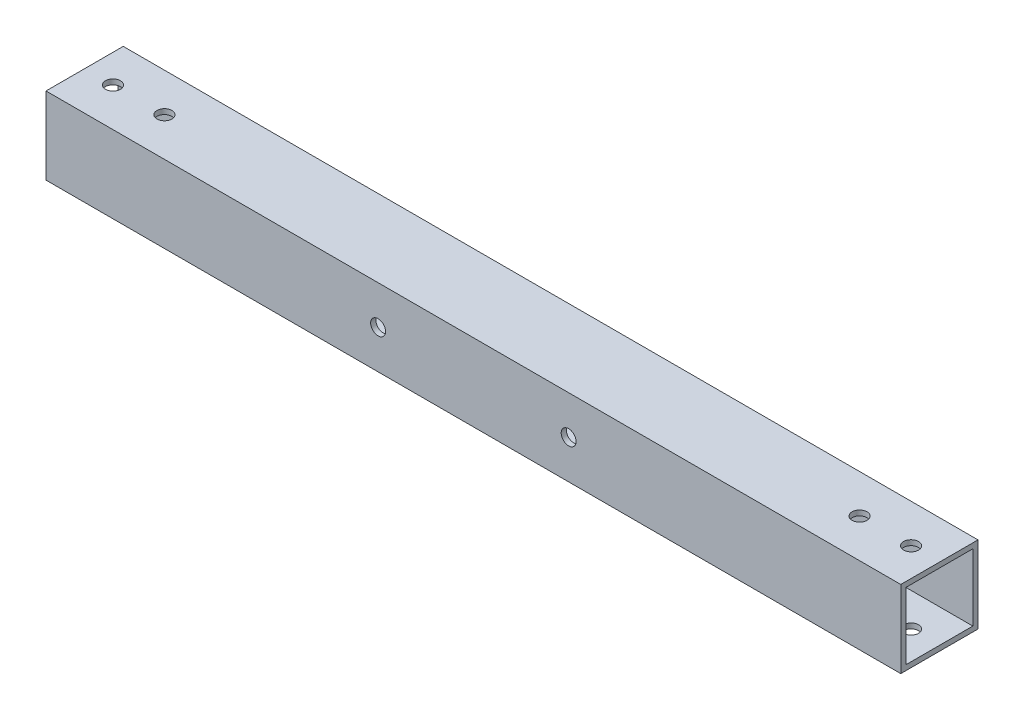
ISO-10303-21;
HEADER;
FILE_DESCRIPTION(('STEP AP214'),'2;1');
FILE_NAME('part.step','',(''),(''),'','','');
FILE_SCHEMA(('AUTOMOTIVE_DESIGN { 1 0 10303 214 1 1 1 1 }'));
ENDSEC;
DATA;
#1=APPLICATION_CONTEXT('core data for automotive mechanical design processes');
#2=APPLICATION_PROTOCOL_DEFINITION('international standard','automotive_design',2000,#1);
#3=PRODUCT_CONTEXT('',#1,'mechanical');
#4=PRODUCT('Part','Part','',(#3));
#5=PRODUCT_RELATED_PRODUCT_CATEGORY('part','',(#4));
#6=PRODUCT_DEFINITION_FORMATION('','',#4);
#7=PRODUCT_DEFINITION_CONTEXT('part definition',#1,'design');
#8=PRODUCT_DEFINITION('design','',#6,#7);
#9=PRODUCT_DEFINITION_SHAPE('','',#8);
#10=(LENGTH_UNIT() NAMED_UNIT(*) SI_UNIT(.MILLI.,.METRE.));
#11=(NAMED_UNIT(*) PLANE_ANGLE_UNIT() SI_UNIT($,.RADIAN.));
#12=(NAMED_UNIT(*) SI_UNIT($,.STERADIAN.) SOLID_ANGLE_UNIT());
#13=UNCERTAINTY_MEASURE_WITH_UNIT(LENGTH_MEASURE(1.E-05),#10,'distance_accuracy_value','');
#14=(GEOMETRIC_REPRESENTATION_CONTEXT(3) GLOBAL_UNCERTAINTY_ASSIGNED_CONTEXT((#13)) GLOBAL_UNIT_ASSIGNED_CONTEXT((#10,
#11,#12)) REPRESENTATION_CONTEXT('',''));
#15=CARTESIAN_POINT('',(0.,0.,0.));
#16=DIRECTION('',(0.,0.,1.));
#17=DIRECTION('',(1.,0.,0.));
#18=AXIS2_PLACEMENT_3D('',#15,#16,#17);
#19=CARTESIAN_POINT('',(83.,-6.50000000000001,-6.49999999999999));
#20=DIRECTION('',(0.,0.,1.));
#21=DIRECTION('',(1.,0.,0.));
#22=AXIS2_PLACEMENT_3D('',#19,#20,#21);
#23=PLANE('',#22);
#24=CARTESIAN_POINT('',(18.5,0.,-6.49999999999999));
#25=DIRECTION('',(0.,0.,1.));
#26=DIRECTION('',(1.,0.,0.));
#27=AXIS2_PLACEMENT_3D('',#24,#25,#26);
#28=CIRCLE('',#27,1.45);
#29=CARTESIAN_POINT('',(19.95,0.,-6.49999999999999));
#30=VERTEX_POINT('',#29);
#31=EDGE_CURVE('E158',#30,#30,#28,.T.);
#32=ORIENTED_EDGE('',*,*,#31,.F.);
#33=EDGE_LOOP('',(#32));
#34=FACE_BOUND('',#33,.T.);
#35=CARTESIAN_POINT('',(-18.5,0.,-6.49999999999999));
#36=DIRECTION('',(0.,0.,1.));
#37=DIRECTION('',(1.,0.,0.));
#38=AXIS2_PLACEMENT_3D('',#35,#36,#37);
#39=CIRCLE('',#38,1.45);
#40=CARTESIAN_POINT('',(-17.05,0.,-6.49999999999999));
#41=VERTEX_POINT('',#40);
#42=EDGE_CURVE('E225',#41,#41,#39,.T.);
#43=ORIENTED_EDGE('',*,*,#42,.F.);
#44=EDGE_LOOP('',(#43));
#45=FACE_BOUND('',#44,.T.);
#46=DIRECTION('',(0.,1.,0.));
#47=VECTOR('',#46,1.);
#48=CARTESIAN_POINT('',(-83.,-6.50000000000001,-6.49999999999999));
#49=LINE('',#48,#47);
#50=CARTESIAN_POINT('',(-83.,-6.50000000000001,-6.49999999999999));
#51=VERTEX_POINT('',#50);
#52=CARTESIAN_POINT('',(-83.,6.49999999999999,-6.49999999999999));
#53=VERTEX_POINT('',#52);
#54=EDGE_CURVE('E164',#51,#53,#49,.T.);
#55=ORIENTED_EDGE('',*,*,#54,.F.);
#56=DIRECTION('',(-1.,0.,0.));
#57=VECTOR('',#56,1.);
#58=CARTESIAN_POINT('',(83.,-6.50000000000001,-6.49999999999999));
#59=LINE('',#58,#57);
#60=CARTESIAN_POINT('',(83.,-6.50000000000001,-6.49999999999999));
#61=VERTEX_POINT('',#60);
#62=EDGE_CURVE('E12',#61,#51,#59,.T.);
#63=ORIENTED_EDGE('',*,*,#62,.F.);
#64=DIRECTION('',(0.,1.,0.));
#65=VECTOR('',#64,1.);
#66=CARTESIAN_POINT('',(83.,-6.50000000000001,-6.49999999999999));
#67=LINE('',#66,#65);
#68=CARTESIAN_POINT('',(83.,6.49999999999999,-6.49999999999999));
#69=VERTEX_POINT('',#68);
#70=EDGE_CURVE('E145',#61,#69,#67,.T.);
#71=ORIENTED_EDGE('',*,*,#70,.T.);
#72=DIRECTION('',(-1.,0.,0.));
#73=VECTOR('',#72,1.);
#74=CARTESIAN_POINT('',(83.,6.49999999999999,-6.49999999999999));
#75=LINE('',#74,#73);
#76=EDGE_CURVE('E76',#69,#53,#75,.T.);
#77=ORIENTED_EDGE('',*,*,#76,.T.);
#78=EDGE_LOOP('',(#55,#63,#71,#77));
#79=FACE_BOUND('',#78,.T.);
#80=ADVANCED_FACE('F57',(#34,#45,#79),#23,.T.);
#81=CARTESIAN_POINT('',(83.,-6.50000000000001,6.50000000000001));
#82=DIRECTION('',(0.,1.,0.));
#83=DIRECTION('',(0.,0.,1.));
#84=AXIS2_PLACEMENT_3D('',#81,#82,#83);
#85=PLANE('',#84);
#86=CARTESIAN_POINT('',(-77.5,-6.50000000000001,0.));
#87=DIRECTION('',(0.,1.,0.));
#88=DIRECTION('',(0.,0.,1.));
#89=AXIS2_PLACEMENT_3D('',#86,#87,#88);
#90=CIRCLE('',#89,1.45);
#91=CARTESIAN_POINT('',(-77.5,-6.50000000000001,1.45));
#92=VERTEX_POINT('',#91);
#93=EDGE_CURVE('E207',#92,#92,#90,.T.);
#94=ORIENTED_EDGE('',*,*,#93,.F.);
#95=EDGE_LOOP('',(#94));
#96=FACE_BOUND('',#95,.T.);
#97=CARTESIAN_POINT('',(-67.5,-6.50000000000001,0.));
#98=DIRECTION('',(0.,1.,0.));
#99=DIRECTION('',(0.,0.,1.));
#100=AXIS2_PLACEMENT_3D('',#97,#98,#99);
#101=CIRCLE('',#100,1.45);
#102=CARTESIAN_POINT('',(-67.5,-6.50000000000001,1.45));
#103=VERTEX_POINT('',#102);
#104=EDGE_CURVE('E195',#103,#103,#101,.T.);
#105=ORIENTED_EDGE('',*,*,#104,.F.);
#106=EDGE_LOOP('',(#105));
#107=FACE_BOUND('',#106,.T.);
#108=CARTESIAN_POINT('',(67.5,-6.50000000000001,0.));
#109=DIRECTION('',(0.,1.,0.));
#110=DIRECTION('',(0.,0.,1.));
#111=AXIS2_PLACEMENT_3D('',#108,#109,#110);
#112=CIRCLE('',#111,1.45);
#113=CARTESIAN_POINT('',(67.5,-6.50000000000001,1.45000000000002));
#114=VERTEX_POINT('',#113);
#115=EDGE_CURVE('E192',#114,#114,#112,.T.);
#116=ORIENTED_EDGE('',*,*,#115,.F.);
#117=EDGE_LOOP('',(#116));
#118=FACE_BOUND('',#117,.T.);
#119=CARTESIAN_POINT('',(77.5,-6.50000000000001,0.));
#120=DIRECTION('',(0.,1.,0.));
#121=DIRECTION('',(0.,0.,1.));
#122=AXIS2_PLACEMENT_3D('',#119,#120,#121);
#123=CIRCLE('',#122,1.45);
#124=CARTESIAN_POINT('',(77.5,-6.50000000000001,1.45000000000002));
#125=VERTEX_POINT('',#124);
#126=EDGE_CURVE('E188',#125,#125,#123,.T.);
#127=ORIENTED_EDGE('',*,*,#126,.F.);
#128=EDGE_LOOP('',(#127));
#129=FACE_BOUND('',#128,.T.);
#130=DIRECTION('',(0.,0.,-1.));
#131=VECTOR('',#130,1.);
#132=CARTESIAN_POINT('',(-83.,-6.50000000000001,6.50000000000001));
#133=LINE('',#132,#131);
#134=CARTESIAN_POINT('',(-83.,-6.50000000000001,6.50000000000001));
#135=VERTEX_POINT('',#134);
#136=EDGE_CURVE('E134',#135,#51,#133,.T.);
#137=ORIENTED_EDGE('',*,*,#136,.F.);
#138=DIRECTION('',(-1.,0.,0.));
#139=VECTOR('',#138,1.);
#140=CARTESIAN_POINT('',(83.,-6.50000000000001,6.50000000000001));
#141=LINE('',#140,#139);
#142=CARTESIAN_POINT('',(83.,-6.50000000000001,6.50000000000001));
#143=VERTEX_POINT('',#142);
#144=EDGE_CURVE('E67',#143,#135,#141,.T.);
#145=ORIENTED_EDGE('',*,*,#144,.F.);
#146=DIRECTION('',(0.,0.,-1.));
#147=VECTOR('',#146,1.);
#148=CARTESIAN_POINT('',(83.,-6.50000000000001,6.50000000000001));
#149=LINE('',#148,#147);
#150=EDGE_CURVE('E132',#143,#61,#149,.T.);
#151=ORIENTED_EDGE('',*,*,#150,.T.);
#152=ORIENTED_EDGE('',*,*,#62,.T.);
#153=EDGE_LOOP('',(#137,#145,#151,#152));
#154=FACE_BOUND('',#153,.T.);
#155=ADVANCED_FACE('F131',(#96,#107,#118,#129,#154),#85,.T.);
#156=CARTESIAN_POINT('',(83.,-6.50000000000001,6.50000000000001));
#157=DIRECTION('',(0.,0.,-1.));
#158=DIRECTION('',(-1.,0.,0.));
#159=AXIS2_PLACEMENT_3D('',#156,#157,#158);
#160=PLANE('',#159);
#161=CARTESIAN_POINT('',(18.5,0.,6.50000000000001));
#162=DIRECTION('',(0.,0.,-1.));
#163=DIRECTION('',(-1.,0.,0.));
#164=AXIS2_PLACEMENT_3D('',#161,#162,#163);
#165=CIRCLE('',#164,1.45);
#166=CARTESIAN_POINT('',(17.05,0.,6.50000000000001));
#167=VERTEX_POINT('',#166);
#168=EDGE_CURVE('E228',#167,#167,#165,.T.);
#169=ORIENTED_EDGE('',*,*,#168,.F.);
#170=EDGE_LOOP('',(#169));
#171=FACE_BOUND('',#170,.T.);
#172=CARTESIAN_POINT('',(-18.5,0.,6.50000000000001));
#173=DIRECTION('',(0.,0.,-1.));
#174=DIRECTION('',(-1.,0.,0.));
#175=AXIS2_PLACEMENT_3D('',#172,#173,#174);
#176=CIRCLE('',#175,1.45);
#177=CARTESIAN_POINT('',(-19.95,0.,6.50000000000001));
#178=VERTEX_POINT('',#177);
#179=EDGE_CURVE('E214',#178,#178,#176,.T.);
#180=ORIENTED_EDGE('',*,*,#179,.F.);
#181=EDGE_LOOP('',(#180));
#182=FACE_BOUND('',#181,.T.);
#183=DIRECTION('',(0.,-1.,0.));
#184=VECTOR('',#183,1.);
#185=CARTESIAN_POINT('',(-83.,-6.50000000000001,6.50000000000001));
#186=LINE('',#185,#184);
#187=CARTESIAN_POINT('',(-83.,6.49999999999999,6.50000000000001));
#188=VERTEX_POINT('',#187);
#189=EDGE_CURVE('E167',#188,#135,#186,.T.);
#190=ORIENTED_EDGE('',*,*,#189,.F.);
#191=DIRECTION('',(-1.,0.,0.));
#192=VECTOR('',#191,1.);
#193=CARTESIAN_POINT('',(83.,6.49999999999999,6.50000000000001));
#194=LINE('',#193,#192);
#195=CARTESIAN_POINT('',(83.,6.49999999999999,6.50000000000001));
#196=VERTEX_POINT('',#195);
#197=EDGE_CURVE('E101',#196,#188,#194,.T.);
#198=ORIENTED_EDGE('',*,*,#197,.F.);
#199=DIRECTION('',(0.,-1.,0.));
#200=VECTOR('',#199,1.);
#201=CARTESIAN_POINT('',(83.,-6.50000000000001,6.50000000000001));
#202=LINE('',#201,#200);
#203=EDGE_CURVE('E144',#196,#143,#202,.T.);
#204=ORIENTED_EDGE('',*,*,#203,.T.);
#205=ORIENTED_EDGE('',*,*,#144,.T.);
#206=EDGE_LOOP('',(#190,#198,#204,#205));
#207=FACE_BOUND('',#206,.T.);
#208=ADVANCED_FACE('F147',(#171,#182,#207),#160,.T.);
#209=CARTESIAN_POINT('',(83.,-7.50000000000001,-7.49999999999999));
#210=DIRECTION('',(0.,0.,1.));
#211=DIRECTION('',(1.,0.,0.));
#212=AXIS2_PLACEMENT_3D('',#209,#210,#211);
#213=PLANE('',#212);
#214=CARTESIAN_POINT('',(18.5,0.,-7.49999999999999));
#215=DIRECTION('',(0.,0.,-1.));
#216=DIRECTION('',(-1.,0.,0.));
#217=AXIS2_PLACEMENT_3D('',#214,#215,#216);
#218=CIRCLE('',#217,1.45);
#219=CARTESIAN_POINT('',(17.05,0.,-7.49999999999999));
#220=VERTEX_POINT('',#219);
#221=EDGE_CURVE('E215',#220,#220,#218,.T.);
#222=ORIENTED_EDGE('',*,*,#221,.F.);
#223=EDGE_LOOP('',(#222));
#224=FACE_BOUND('',#223,.T.);
#225=CARTESIAN_POINT('',(-18.5,0.,-7.49999999999999));
#226=DIRECTION('',(0.,0.,-1.));
#227=DIRECTION('',(-1.,0.,0.));
#228=AXIS2_PLACEMENT_3D('',#225,#226,#227);
#229=CIRCLE('',#228,1.45);
#230=CARTESIAN_POINT('',(-19.95,0.,-7.49999999999999));
#231=VERTEX_POINT('',#230);
#232=EDGE_CURVE('E218',#231,#231,#229,.T.);
#233=ORIENTED_EDGE('',*,*,#232,.F.);
#234=EDGE_LOOP('',(#233));
#235=FACE_BOUND('',#234,.T.);
#236=DIRECTION('',(0.,1.,0.));
#237=VECTOR('',#236,1.);
#238=CARTESIAN_POINT('',(-83.,-7.50000000000001,-7.49999999999999));
#239=LINE('',#238,#237);
#240=CARTESIAN_POINT('',(-83.,-7.50000000000001,-7.49999999999999));
#241=VERTEX_POINT('',#240);
#242=CARTESIAN_POINT('',(-83.,7.49999999999999,-7.49999999999999));
#243=VERTEX_POINT('',#242);
#244=EDGE_CURVE('E154',#241,#243,#239,.T.);
#245=ORIENTED_EDGE('',*,*,#244,.T.);
#246=DIRECTION('',(-1.,0.,0.));
#247=VECTOR('',#246,1.);
#248=CARTESIAN_POINT('',(83.,7.49999999999999,-7.49999999999999));
#249=LINE('',#248,#247);
#250=CARTESIAN_POINT('',(83.,7.49999999999999,-7.49999999999999));
#251=VERTEX_POINT('',#250);
#252=EDGE_CURVE('E174',#251,#243,#249,.T.);
#253=ORIENTED_EDGE('',*,*,#252,.F.);
#254=DIRECTION('',(0.,1.,0.));
#255=VECTOR('',#254,1.);
#256=CARTESIAN_POINT('',(83.,-7.50000000000001,-7.49999999999999));
#257=LINE('',#256,#255);
#258=CARTESIAN_POINT('',(83.,-7.50000000000001,-7.49999999999999));
#259=VERTEX_POINT('',#258);
#260=EDGE_CURVE('E172',#259,#251,#257,.T.);
#261=ORIENTED_EDGE('',*,*,#260,.F.);
#262=DIRECTION('',(-1.,0.,0.));
#263=VECTOR('',#262,1.);
#264=CARTESIAN_POINT('',(83.,-7.50000000000001,-7.49999999999999));
#265=LINE('',#264,#263);
#266=EDGE_CURVE('E150',#259,#241,#265,.T.);
#267=ORIENTED_EDGE('',*,*,#266,.T.);
#268=EDGE_LOOP('',(#245,#253,#261,#267));
#269=FACE_BOUND('',#268,.T.);
#270=ADVANCED_FACE('F59',(#224,#235,#269),#213,.F.);
#271=CARTESIAN_POINT('',(83.,7.49999999999999,7.50000000000001));
#272=DIRECTION('',(0.,-1.,0.));
#273=DIRECTION('',(0.,0.,-1.));
#274=AXIS2_PLACEMENT_3D('',#271,#272,#273);
#275=PLANE('',#274);
#276=CARTESIAN_POINT('',(-77.5,7.49999999999999,0.));
#277=DIRECTION('',(0.,-1.,0.));
#278=DIRECTION('',(0.,0.,-1.));
#279=AXIS2_PLACEMENT_3D('',#276,#277,#278);
#280=CIRCLE('',#279,1.45);
#281=CARTESIAN_POINT('',(-77.5,7.49999999999999,-1.45));
#282=VERTEX_POINT('',#281);
#283=EDGE_CURVE('E189',#282,#282,#280,.T.);
#284=ORIENTED_EDGE('',*,*,#283,.T.);
#285=EDGE_LOOP('',(#284));
#286=FACE_BOUND('',#285,.T.);
#287=CARTESIAN_POINT('',(-67.5,7.49999999999999,0.));
#288=DIRECTION('',(0.,-1.,0.));
#289=DIRECTION('',(0.,0.,-1.));
#290=AXIS2_PLACEMENT_3D('',#287,#288,#289);
#291=CIRCLE('',#290,1.45);
#292=CARTESIAN_POINT('',(-67.5,7.49999999999999,-1.45));
#293=VERTEX_POINT('',#292);
#294=EDGE_CURVE('E286',#293,#293,#291,.T.);
#295=ORIENTED_EDGE('',*,*,#294,.T.);
#296=EDGE_LOOP('',(#295));
#297=FACE_BOUND('',#296,.T.);
#298=CARTESIAN_POINT('',(67.5,7.49999999999999,0.));
#299=DIRECTION('',(0.,-1.,0.));
#300=DIRECTION('',(0.,0.,1.));
#301=AXIS2_PLACEMENT_3D('',#298,#299,#300);
#302=CIRCLE('',#301,1.45);
#303=CARTESIAN_POINT('',(67.5,7.49999999999999,1.45000000000002));
#304=VERTEX_POINT('',#303);
#305=EDGE_CURVE('E290',#304,#304,#302,.T.);
#306=ORIENTED_EDGE('',*,*,#305,.T.);
#307=EDGE_LOOP('',(#306));
#308=FACE_BOUND('',#307,.T.);
#309=CARTESIAN_POINT('',(77.5,7.49999999999999,0.));
#310=DIRECTION('',(0.,-1.,0.));
#311=DIRECTION('',(0.,0.,1.));
#312=AXIS2_PLACEMENT_3D('',#309,#310,#311);
#313=CIRCLE('',#312,1.45);
#314=CARTESIAN_POINT('',(77.5,7.49999999999999,1.45000000000002));
#315=VERTEX_POINT('',#314);
#316=EDGE_CURVE('E293',#315,#315,#313,.T.);
#317=ORIENTED_EDGE('',*,*,#316,.T.);
#318=EDGE_LOOP('',(#317));
#319=FACE_BOUND('',#318,.T.);
#320=DIRECTION('',(0.,0.,1.));
#321=VECTOR('',#320,1.);
#322=CARTESIAN_POINT('',(-83.,7.49999999999999,7.50000000000001));
#323=LINE('',#322,#321);
#324=CARTESIAN_POINT('',(-83.,7.49999999999999,7.50000000000001));
#325=VERTEX_POINT('',#324);
#326=EDGE_CURVE('E157',#243,#325,#323,.T.);
#327=ORIENTED_EDGE('',*,*,#326,.T.);
#328=DIRECTION('',(-1.,0.,0.));
#329=VECTOR('',#328,1.);
#330=CARTESIAN_POINT('',(83.,7.49999999999999,7.50000000000001));
#331=LINE('',#330,#329);
#332=CARTESIAN_POINT('',(83.,7.49999999999999,7.50000000000001));
#333=VERTEX_POINT('',#332);
#334=EDGE_CURVE('E181',#333,#325,#331,.T.);
#335=ORIENTED_EDGE('',*,*,#334,.F.);
#336=DIRECTION('',(0.,0.,1.));
#337=VECTOR('',#336,1.);
#338=CARTESIAN_POINT('',(83.,7.49999999999999,7.50000000000001));
#339=LINE('',#338,#337);
#340=EDGE_CURVE('E114',#251,#333,#339,.T.);
#341=ORIENTED_EDGE('',*,*,#340,.F.);
#342=ORIENTED_EDGE('',*,*,#252,.T.);
#343=EDGE_LOOP('',(#327,#335,#341,#342));
#344=FACE_BOUND('',#343,.T.);
#345=ADVANCED_FACE('F272',(#286,#297,#308,#319,#344),#275,.F.);
#346=CARTESIAN_POINT('',(83.,-7.50000000000001,7.49999999999999));
#347=DIRECTION('',(0.,0.,-1.));
#348=DIRECTION('',(0.,1.,0.));
#349=AXIS2_PLACEMENT_3D('',#346,#347,#348);
#350=PLANE('',#349);
#351=CARTESIAN_POINT('',(18.5,0.,7.50000000000001));
#352=DIRECTION('',(0.,0.,-1.));
#353=DIRECTION('',(-1.,0.,0.));
#354=AXIS2_PLACEMENT_3D('',#351,#352,#353);
#355=CIRCLE('',#354,1.45);
#356=CARTESIAN_POINT('',(17.05,0.,7.50000000000001));
#357=VERTEX_POINT('',#356);
#358=EDGE_CURVE('E211',#357,#357,#355,.T.);
#359=ORIENTED_EDGE('',*,*,#358,.T.);
#360=EDGE_LOOP('',(#359));
#361=FACE_BOUND('',#360,.T.);
#362=CARTESIAN_POINT('',(-18.5,0.,7.50000000000001));
#363=DIRECTION('',(0.,0.,-1.));
#364=DIRECTION('',(-1.,0.,0.));
#365=AXIS2_PLACEMENT_3D('',#362,#363,#364);
#366=CIRCLE('',#365,1.45);
#367=CARTESIAN_POINT('',(-19.95,0.,7.50000000000001));
#368=VERTEX_POINT('',#367);
#369=EDGE_CURVE('E210',#368,#368,#366,.T.);
#370=ORIENTED_EDGE('',*,*,#369,.T.);
#371=EDGE_LOOP('',(#370));
#372=FACE_BOUND('',#371,.T.);
#373=DIRECTION('',(0.,-1.,0.));
#374=VECTOR('',#373,1.);
#375=CARTESIAN_POINT('',(-83.,-7.50000000000001,7.49999999999999));
#376=LINE('',#375,#374);
#377=CARTESIAN_POINT('',(-83.,-7.50000000000001,7.49999999999999));
#378=VERTEX_POINT('',#377);
#379=EDGE_CURVE('E160',#325,#378,#376,.T.);
#380=ORIENTED_EDGE('',*,*,#379,.T.);
#381=DIRECTION('',(-1.,0.,0.));
#382=VECTOR('',#381,1.);
#383=CARTESIAN_POINT('',(83.,-7.50000000000001,7.49999999999999));
#384=LINE('',#383,#382);
#385=CARTESIAN_POINT('',(83.,-7.50000000000001,7.49999999999999));
#386=VERTEX_POINT('',#385);
#387=EDGE_CURVE('E178',#386,#378,#384,.T.);
#388=ORIENTED_EDGE('',*,*,#387,.F.);
#389=DIRECTION('',(0.,-1.,0.));
#390=VECTOR('',#389,1.);
#391=CARTESIAN_POINT('',(83.,-7.50000000000001,7.49999999999999));
#392=LINE('',#391,#390);
#393=EDGE_CURVE('E235',#333,#386,#392,.T.);
#394=ORIENTED_EDGE('',*,*,#393,.F.);
#395=ORIENTED_EDGE('',*,*,#334,.T.);
#396=EDGE_LOOP('',(#380,#388,#394,#395));
#397=FACE_BOUND('',#396,.T.);
#398=ADVANCED_FACE('F251',(#361,#372,#397),#350,.F.);
#399=CARTESIAN_POINT('',(83.,-7.50000000000001,7.49999999999999));
#400=DIRECTION('',(0.,1.,0.));
#401=DIRECTION('',(0.,0.,1.));
#402=AXIS2_PLACEMENT_3D('',#399,#400,#401);
#403=PLANE('',#402);
#404=CARTESIAN_POINT('',(-77.5,-7.50000000000001,0.));
#405=DIRECTION('',(0.,-1.,0.));
#406=DIRECTION('',(0.,0.,-1.));
#407=AXIS2_PLACEMENT_3D('',#404,#405,#406);
#408=CIRCLE('',#407,1.45);
#409=CARTESIAN_POINT('',(-77.5,-7.50000000000001,-1.45));
#410=VERTEX_POINT('',#409);
#411=EDGE_CURVE('E354',#410,#410,#408,.T.);
#412=ORIENTED_EDGE('',*,*,#411,.F.);
#413=EDGE_LOOP('',(#412));
#414=FACE_BOUND('',#413,.T.);
#415=CARTESIAN_POINT('',(-67.5,-7.50000000000001,0.));
#416=DIRECTION('',(0.,-1.,0.));
#417=DIRECTION('',(0.,0.,-1.));
#418=AXIS2_PLACEMENT_3D('',#415,#416,#417);
#419=CIRCLE('',#418,1.45);
#420=CARTESIAN_POINT('',(-67.5,-7.50000000000001,-1.45));
#421=VERTEX_POINT('',#420);
#422=EDGE_CURVE('E355',#421,#421,#419,.T.);
#423=ORIENTED_EDGE('',*,*,#422,.F.);
#424=EDGE_LOOP('',(#423));
#425=FACE_BOUND('',#424,.T.);
#426=CARTESIAN_POINT('',(67.5,-7.50000000000001,0.));
#427=DIRECTION('',(0.,-1.,0.));
#428=DIRECTION('',(0.,0.,1.));
#429=AXIS2_PLACEMENT_3D('',#426,#427,#428);
#430=CIRCLE('',#429,1.45);
#431=CARTESIAN_POINT('',(67.5,-7.50000000000001,1.45000000000002));
#432=VERTEX_POINT('',#431);
#433=EDGE_CURVE('E362',#432,#432,#430,.T.);
#434=ORIENTED_EDGE('',*,*,#433,.F.);
#435=EDGE_LOOP('',(#434));
#436=FACE_BOUND('',#435,.T.);
#437=CARTESIAN_POINT('',(77.5,-7.50000000000001,0.));
#438=DIRECTION('',(0.,-1.,0.));
#439=DIRECTION('',(0.,0.,1.));
#440=AXIS2_PLACEMENT_3D('',#437,#438,#439);
#441=CIRCLE('',#440,1.45);
#442=CARTESIAN_POINT('',(77.5,-7.50000000000001,1.45000000000002));
#443=VERTEX_POINT('',#442);
#444=EDGE_CURVE('E366',#443,#443,#441,.T.);
#445=ORIENTED_EDGE('',*,*,#444,.F.);
#446=EDGE_LOOP('',(#445));
#447=FACE_BOUND('',#446,.T.);
#448=DIRECTION('',(0.,0.,-1.));
#449=VECTOR('',#448,1.);
#450=CARTESIAN_POINT('',(-83.,-7.50000000000001,7.49999999999999));
#451=LINE('',#450,#449);
#452=EDGE_CURVE('E162',#378,#241,#451,.T.);
#453=ORIENTED_EDGE('',*,*,#452,.T.);
#454=ORIENTED_EDGE('',*,*,#266,.F.);
#455=DIRECTION('',(0.,0.,-1.));
#456=VECTOR('',#455,1.);
#457=CARTESIAN_POINT('',(83.,-7.50000000000001,7.49999999999999));
#458=LINE('',#457,#456);
#459=EDGE_CURVE('E237',#386,#259,#458,.T.);
#460=ORIENTED_EDGE('',*,*,#459,.F.);
#461=ORIENTED_EDGE('',*,*,#387,.T.);
#462=EDGE_LOOP('',(#453,#454,#460,#461));
#463=FACE_BOUND('',#462,.T.);
#464=ADVANCED_FACE('F240',(#414,#425,#436,#447,#463),#403,.F.);
#465=CARTESIAN_POINT('',(83.,6.49999999999999,6.50000000000001));
#466=DIRECTION('',(0.,-1.,0.));
#467=DIRECTION('',(0.,0.,-1.));
#468=AXIS2_PLACEMENT_3D('',#465,#466,#467);
#469=PLANE('',#468);
#470=CARTESIAN_POINT('',(-77.5,6.49999999999999,0.));
#471=DIRECTION('',(0.,-1.,0.));
#472=DIRECTION('',(0.,0.,-1.));
#473=AXIS2_PLACEMENT_3D('',#470,#471,#472);
#474=CIRCLE('',#473,1.45);
#475=CARTESIAN_POINT('',(-77.5,6.49999999999999,-1.45));
#476=VERTEX_POINT('',#475);
#477=EDGE_CURVE('E61',#476,#476,#474,.T.);
#478=ORIENTED_EDGE('',*,*,#477,.F.);
#479=EDGE_LOOP('',(#478));
#480=FACE_BOUND('',#479,.T.);
#481=CARTESIAN_POINT('',(-67.5,6.49999999999999,0.));
#482=DIRECTION('',(0.,-1.,0.));
#483=DIRECTION('',(0.,0.,-1.));
#484=AXIS2_PLACEMENT_3D('',#481,#482,#483);
#485=CIRCLE('',#484,1.45);
#486=CARTESIAN_POINT('',(-67.5,6.49999999999999,-1.45));
#487=VERTEX_POINT('',#486);
#488=EDGE_CURVE('E193',#487,#487,#485,.T.);
#489=ORIENTED_EDGE('',*,*,#488,.F.);
#490=EDGE_LOOP('',(#489));
#491=FACE_BOUND('',#490,.T.);
#492=CARTESIAN_POINT('',(67.5,6.49999999999999,0.));
#493=DIRECTION('',(0.,-1.,0.));
#494=DIRECTION('',(0.,0.,-1.));
#495=AXIS2_PLACEMENT_3D('',#492,#493,#494);
#496=CIRCLE('',#495,1.45);
#497=CARTESIAN_POINT('',(67.5,6.49999999999999,-1.44999999999998));
#498=VERTEX_POINT('',#497);
#499=EDGE_CURVE('E190',#498,#498,#496,.T.);
#500=ORIENTED_EDGE('',*,*,#499,.F.);
#501=EDGE_LOOP('',(#500));
#502=FACE_BOUND('',#501,.T.);
#503=CARTESIAN_POINT('',(77.5,6.49999999999999,0.));
#504=DIRECTION('',(0.,-1.,0.));
#505=DIRECTION('',(0.,0.,-1.));
#506=AXIS2_PLACEMENT_3D('',#503,#504,#505);
#507=CIRCLE('',#506,1.45);
#508=CARTESIAN_POINT('',(77.5,6.49999999999999,-1.44999999999998));
#509=VERTEX_POINT('',#508);
#510=EDGE_CURVE('E185',#509,#509,#507,.T.);
#511=ORIENTED_EDGE('',*,*,#510,.F.);
#512=EDGE_LOOP('',(#511));
#513=FACE_BOUND('',#512,.T.);
#514=DIRECTION('',(0.,0.,1.));
#515=VECTOR('',#514,1.);
#516=CARTESIAN_POINT('',(-83.,6.49999999999999,6.50000000000001));
#517=LINE('',#516,#515);
#518=EDGE_CURVE('E169',#53,#188,#517,.T.);
#519=ORIENTED_EDGE('',*,*,#518,.F.);
#520=ORIENTED_EDGE('',*,*,#76,.F.);
#521=DIRECTION('',(0.,0.,1.));
#522=VECTOR('',#521,1.);
#523=CARTESIAN_POINT('',(83.,6.49999999999999,6.50000000000001));
#524=LINE('',#523,#522);
#525=EDGE_CURVE('E148',#69,#196,#524,.T.);
#526=ORIENTED_EDGE('',*,*,#525,.T.);
#527=ORIENTED_EDGE('',*,*,#197,.T.);
#528=EDGE_LOOP('',(#519,#520,#526,#527));
#529=FACE_BOUND('',#528,.T.);
#530=ADVANCED_FACE('F238',(#480,#491,#502,#513,#529),#469,.T.);
#531=CARTESIAN_POINT('',(83.,0.,0.));
#532=DIRECTION('',(-1.,0.,0.));
#533=DIRECTION('',(0.,0.,1.));
#534=AXIS2_PLACEMENT_3D('',#531,#532,#533);
#535=PLANE('',#534);
#536=ORIENTED_EDGE('',*,*,#260,.T.);
#537=ORIENTED_EDGE('',*,*,#340,.T.);
#538=ORIENTED_EDGE('',*,*,#393,.T.);
#539=ORIENTED_EDGE('',*,*,#459,.T.);
#540=EDGE_LOOP('',(#536,#537,#538,#539));
#541=FACE_BOUND('',#540,.T.);
#542=ORIENTED_EDGE('',*,*,#70,.F.);
#543=ORIENTED_EDGE('',*,*,#150,.F.);
#544=ORIENTED_EDGE('',*,*,#203,.F.);
#545=ORIENTED_EDGE('',*,*,#525,.F.);
#546=EDGE_LOOP('',(#542,#543,#544,#545));
#547=FACE_BOUND('',#546,.T.);
#548=ADVANCED_FACE('F142',(#541,#547),#535,.F.);
#549=CARTESIAN_POINT('',(-83.,0.,0.));
#550=DIRECTION('',(-1.,0.,0.));
#551=DIRECTION('',(0.,0.,1.));
#552=AXIS2_PLACEMENT_3D('',#549,#550,#551);
#553=PLANE('',#552);
#554=ORIENTED_EDGE('',*,*,#244,.F.);
#555=ORIENTED_EDGE('',*,*,#452,.F.);
#556=ORIENTED_EDGE('',*,*,#379,.F.);
#557=ORIENTED_EDGE('',*,*,#326,.F.);
#558=EDGE_LOOP('',(#554,#555,#556,#557));
#559=FACE_BOUND('',#558,.T.);
#560=ORIENTED_EDGE('',*,*,#54,.T.);
#561=ORIENTED_EDGE('',*,*,#518,.T.);
#562=ORIENTED_EDGE('',*,*,#189,.T.);
#563=ORIENTED_EDGE('',*,*,#136,.T.);
#564=EDGE_LOOP('',(#560,#561,#562,#563));
#565=FACE_BOUND('',#564,.T.);
#566=ADVANCED_FACE('F248',(#559,#565),#553,.T.);
#567=CARTESIAN_POINT('',(-18.5,0.,7.50000000000001));
#568=DIRECTION('',(0.,0.,-1.));
#569=DIRECTION('',(-1.,0.,0.));
#570=AXIS2_PLACEMENT_3D('',#567,#568,#569);
#571=CYLINDRICAL_SURFACE('',#570,1.45);
#572=ORIENTED_EDGE('',*,*,#179,.T.);
#573=EDGE_LOOP('',(#572));
#574=FACE_BOUND('',#573,.T.);
#575=ORIENTED_EDGE('',*,*,#369,.F.);
#576=EDGE_LOOP('',(#575));
#577=FACE_BOUND('',#576,.T.);
#578=ADVANCED_FACE('F308',(#574,#577),#571,.F.);
#579=CARTESIAN_POINT('',(18.5,0.,7.50000000000001));
#580=DIRECTION('',(0.,0.,-1.));
#581=DIRECTION('',(-1.,0.,0.));
#582=AXIS2_PLACEMENT_3D('',#579,#580,#581);
#583=CYLINDRICAL_SURFACE('',#582,1.45);
#584=ORIENTED_EDGE('',*,*,#168,.T.);
#585=EDGE_LOOP('',(#584));
#586=FACE_BOUND('',#585,.T.);
#587=ORIENTED_EDGE('',*,*,#358,.F.);
#588=EDGE_LOOP('',(#587));
#589=FACE_BOUND('',#588,.T.);
#590=ADVANCED_FACE('F312',(#586,#589),#583,.F.);
#591=ORIENTED_EDGE('',*,*,#42,.T.);
#592=EDGE_LOOP('',(#591));
#593=FACE_BOUND('',#592,.T.);
#594=ORIENTED_EDGE('',*,*,#232,.T.);
#595=EDGE_LOOP('',(#594));
#596=FACE_BOUND('',#595,.T.);
#597=ADVANCED_FACE('F315',(#593,#596),#571,.F.);
#598=ORIENTED_EDGE('',*,*,#31,.T.);
#599=EDGE_LOOP('',(#598));
#600=FACE_BOUND('',#599,.T.);
#601=ORIENTED_EDGE('',*,*,#221,.T.);
#602=EDGE_LOOP('',(#601));
#603=FACE_BOUND('',#602,.T.);
#604=ADVANCED_FACE('F320',(#600,#603),#583,.F.);
#605=CARTESIAN_POINT('',(77.5,7.49999999999999,0.));
#606=DIRECTION('',(0.,-1.,0.));
#607=DIRECTION('',(0.,0.,-1.));
#608=AXIS2_PLACEMENT_3D('',#605,#606,#607);
#609=CYLINDRICAL_SURFACE('',#608,1.45);
#610=ORIENTED_EDGE('',*,*,#510,.T.);
#611=EDGE_LOOP('',(#610));
#612=FACE_BOUND('',#611,.T.);
#613=ORIENTED_EDGE('',*,*,#316,.F.);
#614=EDGE_LOOP('',(#613));
#615=FACE_BOUND('',#614,.T.);
#616=ADVANCED_FACE('F321',(#612,#615),#609,.F.);
#617=CARTESIAN_POINT('',(67.5,7.49999999999999,0.));
#618=DIRECTION('',(0.,-1.,0.));
#619=DIRECTION('',(0.,0.,-1.));
#620=AXIS2_PLACEMENT_3D('',#617,#618,#619);
#621=CYLINDRICAL_SURFACE('',#620,1.45);
#622=ORIENTED_EDGE('',*,*,#499,.T.);
#623=EDGE_LOOP('',(#622));
#624=FACE_BOUND('',#623,.T.);
#625=ORIENTED_EDGE('',*,*,#305,.F.);
#626=EDGE_LOOP('',(#625));
#627=FACE_BOUND('',#626,.T.);
#628=ADVANCED_FACE('F323',(#624,#627),#621,.F.);
#629=CARTESIAN_POINT('',(-67.5,7.49999999999999,0.));
#630=DIRECTION('',(0.,-1.,0.));
#631=DIRECTION('',(0.,0.,-1.));
#632=AXIS2_PLACEMENT_3D('',#629,#630,#631);
#633=CYLINDRICAL_SURFACE('',#632,1.45);
#634=ORIENTED_EDGE('',*,*,#488,.T.);
#635=EDGE_LOOP('',(#634));
#636=FACE_BOUND('',#635,.T.);
#637=ORIENTED_EDGE('',*,*,#294,.F.);
#638=EDGE_LOOP('',(#637));
#639=FACE_BOUND('',#638,.T.);
#640=ADVANCED_FACE('F328',(#636,#639),#633,.F.);
#641=CARTESIAN_POINT('',(-77.5,7.49999999999999,0.));
#642=DIRECTION('',(0.,-1.,0.));
#643=DIRECTION('',(0.,0.,-1.));
#644=AXIS2_PLACEMENT_3D('',#641,#642,#643);
#645=CYLINDRICAL_SURFACE('',#644,1.45);
#646=ORIENTED_EDGE('',*,*,#477,.T.);
#647=EDGE_LOOP('',(#646));
#648=FACE_BOUND('',#647,.T.);
#649=ORIENTED_EDGE('',*,*,#283,.F.);
#650=EDGE_LOOP('',(#649));
#651=FACE_BOUND('',#650,.T.);
#652=ADVANCED_FACE('F333',(#648,#651),#645,.F.);
#653=ORIENTED_EDGE('',*,*,#126,.T.);
#654=EDGE_LOOP('',(#653));
#655=FACE_BOUND('',#654,.T.);
#656=ORIENTED_EDGE('',*,*,#444,.T.);
#657=EDGE_LOOP('',(#656));
#658=FACE_BOUND('',#657,.T.);
#659=ADVANCED_FACE('F325',(#655,#658),#609,.F.);
#660=ORIENTED_EDGE('',*,*,#115,.T.);
#661=EDGE_LOOP('',(#660));
#662=FACE_BOUND('',#661,.T.);
#663=ORIENTED_EDGE('',*,*,#433,.T.);
#664=EDGE_LOOP('',(#663));
#665=FACE_BOUND('',#664,.T.);
#666=ADVANCED_FACE('F330',(#662,#665),#621,.F.);
#667=ORIENTED_EDGE('',*,*,#104,.T.);
#668=EDGE_LOOP('',(#667));
#669=FACE_BOUND('',#668,.T.);
#670=ORIENTED_EDGE('',*,*,#422,.T.);
#671=EDGE_LOOP('',(#670));
#672=FACE_BOUND('',#671,.T.);
#673=ADVANCED_FACE('F334',(#669,#672),#633,.F.);
#674=ORIENTED_EDGE('',*,*,#93,.T.);
#675=EDGE_LOOP('',(#674));
#676=FACE_BOUND('',#675,.T.);
#677=ORIENTED_EDGE('',*,*,#411,.T.);
#678=EDGE_LOOP('',(#677));
#679=FACE_BOUND('',#678,.T.);
#680=ADVANCED_FACE('F337',(#676,#679),#645,.F.);
#681=CLOSED_SHELL('',(#80,#155,#208,#270,#345,#398,#464,#530,#548,#566,#578,#590,#597,#604,#616,
#628,#640,#652,#659,#666,#673,#680));
#682=MANIFOLD_SOLID_BREP('B2',#681);
#683=ADVANCED_BREP_SHAPE_REPRESENTATION('',(#18,#682),#14);
#684=SHAPE_DEFINITION_REPRESENTATION(#9,#683);
ENDSEC;
END-ISO-10303-21;
